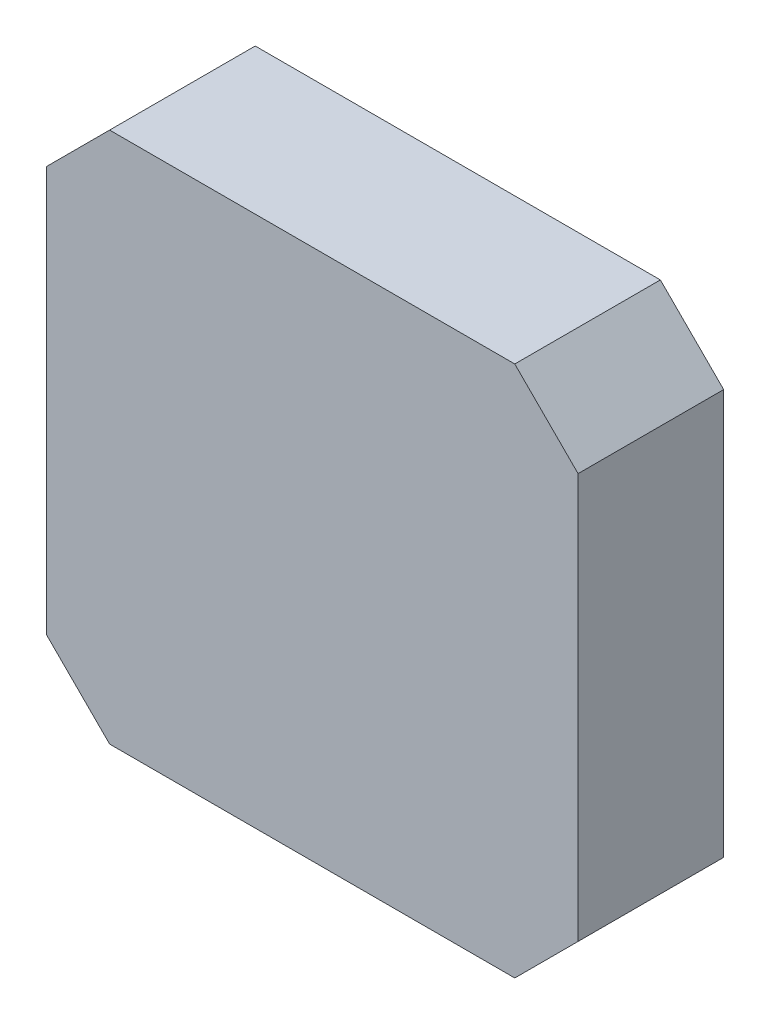
ISO-10303-21;
HEADER;
FILE_DESCRIPTION(('STEP AP214'),'2;1');
FILE_NAME('part.step','',(''),(''),'','','');
FILE_SCHEMA(('AUTOMOTIVE_DESIGN { 1 0 10303 214 1 1 1 1 }'));
ENDSEC;
DATA;
#1=APPLICATION_CONTEXT('core data for automotive mechanical design processes');
#2=APPLICATION_PROTOCOL_DEFINITION('international standard','automotive_design',2000,#1);
#3=PRODUCT_CONTEXT('',#1,'mechanical');
#4=PRODUCT('Part','Part','',(#3));
#5=PRODUCT_RELATED_PRODUCT_CATEGORY('part','',(#4));
#6=PRODUCT_DEFINITION_FORMATION('','',#4);
#7=PRODUCT_DEFINITION_CONTEXT('part definition',#1,'design');
#8=PRODUCT_DEFINITION('design','',#6,#7);
#9=PRODUCT_DEFINITION_SHAPE('','',#8);
#10=(LENGTH_UNIT() NAMED_UNIT(*) SI_UNIT(.MILLI.,.METRE.));
#11=(NAMED_UNIT(*) PLANE_ANGLE_UNIT() SI_UNIT($,.RADIAN.));
#12=(NAMED_UNIT(*) SI_UNIT($,.STERADIAN.) SOLID_ANGLE_UNIT());
#13=UNCERTAINTY_MEASURE_WITH_UNIT(LENGTH_MEASURE(1.E-05),#10,'distance_accuracy_value','');
#14=(GEOMETRIC_REPRESENTATION_CONTEXT(3) GLOBAL_UNCERTAINTY_ASSIGNED_CONTEXT((#13)) GLOBAL_UNIT_ASSIGNED_CONTEXT((#10,
#11,#12)) REPRESENTATION_CONTEXT('',''));
#15=CARTESIAN_POINT('',(0.,0.,0.));
#16=DIRECTION('',(0.,0.,1.));
#17=DIRECTION('',(1.,0.,0.));
#18=AXIS2_PLACEMENT_3D('',#15,#16,#17);
#19=CARTESIAN_POINT('',(21.,21.,11.5));
#20=DIRECTION('',(-1.,0.,0.));
#21=DIRECTION('',(0.,0.,1.));
#22=AXIS2_PLACEMENT_3D('',#19,#20,#21);
#23=PLANE('',#22);
#24=DIRECTION('',(0.,1.,0.));
#25=VECTOR('',#24,1.);
#26=CARTESIAN_POINT('',(21.,21.,0.));
#27=LINE('',#26,#25);
#28=CARTESIAN_POINT('',(21.,-16.,0.));
#29=VERTEX_POINT('',#28);
#30=CARTESIAN_POINT('',(21.,16.,0.));
#31=VERTEX_POINT('',#30);
#32=EDGE_CURVE('E132',#29,#31,#27,.T.);
#33=ORIENTED_EDGE('',*,*,#32,.T.);
#34=DIRECTION('',(0.,0.,1.));
#35=VECTOR('',#34,1.);
#36=CARTESIAN_POINT('',(21.,16.,11.5));
#37=LINE('',#36,#35);
#38=CARTESIAN_POINT('',(21.,16.,11.5));
#39=VERTEX_POINT('',#38);
#40=EDGE_CURVE('E155',#31,#39,#37,.T.);
#41=ORIENTED_EDGE('',*,*,#40,.T.);
#42=DIRECTION('',(0.,1.,0.));
#43=VECTOR('',#42,1.);
#44=CARTESIAN_POINT('',(21.,21.,11.5));
#45=LINE('',#44,#43);
#46=CARTESIAN_POINT('',(21.,-16.,11.5));
#47=VERTEX_POINT('',#46);
#48=EDGE_CURVE('E130',#47,#39,#45,.T.);
#49=ORIENTED_EDGE('',*,*,#48,.F.);
#50=DIRECTION('',(0.,0.,-1.));
#51=VECTOR('',#50,1.);
#52=CARTESIAN_POINT('',(21.,-16.,11.5));
#53=LINE('',#52,#51);
#54=EDGE_CURVE('E152',#47,#29,#53,.T.);
#55=ORIENTED_EDGE('',*,*,#54,.T.);
#56=EDGE_LOOP('',(#33,#41,#49,#55));
#57=FACE_BOUND('',#56,.T.);
#58=ADVANCED_FACE('F37',(#57),#23,.F.);
#59=CARTESIAN_POINT('',(-21.,21.,11.5));
#60=DIRECTION('',(0.,-1.,0.));
#61=DIRECTION('',(0.,0.,-1.));
#62=AXIS2_PLACEMENT_3D('',#59,#60,#61);
#63=PLANE('',#62);
#64=DIRECTION('',(-1.,0.,0.));
#65=VECTOR('',#64,1.);
#66=CARTESIAN_POINT('',(-21.,21.,0.));
#67=LINE('',#66,#65);
#68=CARTESIAN_POINT('',(16.,21.,0.));
#69=VERTEX_POINT('',#68);
#70=CARTESIAN_POINT('',(-16.,21.,0.));
#71=VERTEX_POINT('',#70);
#72=EDGE_CURVE('E128',#69,#71,#67,.T.);
#73=ORIENTED_EDGE('',*,*,#72,.T.);
#74=DIRECTION('',(0.,0.,1.));
#75=VECTOR('',#74,1.);
#76=CARTESIAN_POINT('',(-16.,21.,11.5));
#77=LINE('',#76,#75);
#78=CARTESIAN_POINT('',(-16.,21.,11.5));
#79=VERTEX_POINT('',#78);
#80=EDGE_CURVE('E107',#71,#79,#77,.T.);
#81=ORIENTED_EDGE('',*,*,#80,.T.);
#82=DIRECTION('',(-1.,0.,0.));
#83=VECTOR('',#82,1.);
#84=CARTESIAN_POINT('',(-21.,21.,11.5));
#85=LINE('',#84,#83);
#86=CARTESIAN_POINT('',(16.,21.,11.5));
#87=VERTEX_POINT('',#86);
#88=EDGE_CURVE('E171',#87,#79,#85,.T.);
#89=ORIENTED_EDGE('',*,*,#88,.F.);
#90=DIRECTION('',(0.,0.,-1.));
#91=VECTOR('',#90,1.);
#92=CARTESIAN_POINT('',(16.,21.,11.5));
#93=LINE('',#92,#91);
#94=EDGE_CURVE('E112',#87,#69,#93,.T.);
#95=ORIENTED_EDGE('',*,*,#94,.T.);
#96=EDGE_LOOP('',(#73,#81,#89,#95));
#97=FACE_BOUND('',#96,.T.);
#98=ADVANCED_FACE('F188',(#97),#63,.F.);
#99=CARTESIAN_POINT('',(-21.,21.,11.5));
#100=DIRECTION('',(1.,0.,0.));
#101=DIRECTION('',(0.,1.,0.));
#102=AXIS2_PLACEMENT_3D('',#99,#100,#101);
#103=PLANE('',#102);
#104=DIRECTION('',(0.,-1.,0.));
#105=VECTOR('',#104,1.);
#106=CARTESIAN_POINT('',(-21.,21.,11.5));
#107=LINE('',#106,#105);
#108=CARTESIAN_POINT('',(-21.,16.,11.5));
#109=VERTEX_POINT('',#108);
#110=CARTESIAN_POINT('',(-21.,-16.,11.5));
#111=VERTEX_POINT('',#110);
#112=EDGE_CURVE('E121',#109,#111,#107,.T.);
#113=ORIENTED_EDGE('',*,*,#112,.F.);
#114=DIRECTION('',(0.,0.,-1.));
#115=VECTOR('',#114,1.);
#116=CARTESIAN_POINT('',(-21.,16.,11.5));
#117=LINE('',#116,#115);
#118=CARTESIAN_POINT('',(-21.,16.,0.));
#119=VERTEX_POINT('',#118);
#120=EDGE_CURVE('E106',#109,#119,#117,.T.);
#121=ORIENTED_EDGE('',*,*,#120,.T.);
#122=DIRECTION('',(0.,-1.,0.));
#123=VECTOR('',#122,1.);
#124=CARTESIAN_POINT('',(-21.,21.,0.));
#125=LINE('',#124,#123);
#126=CARTESIAN_POINT('',(-21.,-16.,0.));
#127=VERTEX_POINT('',#126);
#128=EDGE_CURVE('E119',#119,#127,#125,.T.);
#129=ORIENTED_EDGE('',*,*,#128,.T.);
#130=DIRECTION('',(0.,0.,1.));
#131=VECTOR('',#130,1.);
#132=CARTESIAN_POINT('',(-21.,-16.,11.5));
#133=LINE('',#132,#131);
#134=EDGE_CURVE('E123',#127,#111,#133,.T.);
#135=ORIENTED_EDGE('',*,*,#134,.T.);
#136=EDGE_LOOP('',(#113,#121,#129,#135));
#137=FACE_BOUND('',#136,.T.);
#138=ADVANCED_FACE('F118',(#137),#103,.F.);
#139=CARTESIAN_POINT('',(-21.,-21.,11.5));
#140=DIRECTION('',(0.,1.,0.));
#141=DIRECTION('',(0.,0.,1.));
#142=AXIS2_PLACEMENT_3D('',#139,#140,#141);
#143=PLANE('',#142);
#144=DIRECTION('',(1.,0.,0.));
#145=VECTOR('',#144,1.);
#146=CARTESIAN_POINT('',(-21.,-21.,0.));
#147=LINE('',#146,#145);
#148=CARTESIAN_POINT('',(-16.,-21.,0.));
#149=VERTEX_POINT('',#148);
#150=CARTESIAN_POINT('',(16.,-21.,0.));
#151=VERTEX_POINT('',#150);
#152=EDGE_CURVE('E127',#149,#151,#147,.T.);
#153=ORIENTED_EDGE('',*,*,#152,.T.);
#154=DIRECTION('',(0.,0.,1.));
#155=VECTOR('',#154,1.);
#156=CARTESIAN_POINT('',(16.,-21.,11.5));
#157=LINE('',#156,#155);
#158=CARTESIAN_POINT('',(16.,-21.,11.5));
#159=VERTEX_POINT('',#158);
#160=EDGE_CURVE('E11',#151,#159,#157,.T.);
#161=ORIENTED_EDGE('',*,*,#160,.T.);
#162=DIRECTION('',(1.,0.,0.));
#163=VECTOR('',#162,1.);
#164=CARTESIAN_POINT('',(-21.,-21.,11.5));
#165=LINE('',#164,#163);
#166=CARTESIAN_POINT('',(-16.,-21.,11.5));
#167=VERTEX_POINT('',#166);
#168=EDGE_CURVE('E136',#167,#159,#165,.T.);
#169=ORIENTED_EDGE('',*,*,#168,.F.);
#170=DIRECTION('',(0.,0.,-1.));
#171=VECTOR('',#170,1.);
#172=CARTESIAN_POINT('',(-16.,-21.,11.5));
#173=LINE('',#172,#171);
#174=EDGE_CURVE('E45',#167,#149,#173,.T.);
#175=ORIENTED_EDGE('',*,*,#174,.T.);
#176=EDGE_LOOP('',(#153,#161,#169,#175));
#177=FACE_BOUND('',#176,.T.);
#178=ADVANCED_FACE('F158',(#177),#143,.F.);
#179=CARTESIAN_POINT('',(0.,0.,11.5));
#180=DIRECTION('',(0.,0.,1.));
#181=DIRECTION('',(1.,0.,0.));
#182=AXIS2_PLACEMENT_3D('',#179,#180,#181);
#183=PLANE('',#182);
#184=ORIENTED_EDGE('',*,*,#88,.T.);
#185=DIRECTION('',(0.707106781186549,0.707106781186547,0.));
#186=VECTOR('',#185,1.);
#187=CARTESIAN_POINT('',(-18.5,18.5,11.5));
#188=LINE('',#187,#186);
#189=EDGE_CURVE('E150',#79,#109,#188,.F.);
#190=ORIENTED_EDGE('',*,*,#189,.T.);
#191=ORIENTED_EDGE('',*,*,#112,.T.);
#192=DIRECTION('',(-0.707106781186547,0.707106781186549,0.));
#193=VECTOR('',#192,1.);
#194=CARTESIAN_POINT('',(-18.5,-18.5,11.5));
#195=LINE('',#194,#193);
#196=EDGE_CURVE('E57',#111,#167,#195,.F.);
#197=ORIENTED_EDGE('',*,*,#196,.T.);
#198=ORIENTED_EDGE('',*,*,#168,.T.);
#199=DIRECTION('',(-0.707106781186549,-0.707106781186546,0.));
#200=VECTOR('',#199,1.);
#201=CARTESIAN_POINT('',(18.5,-18.5,11.5));
#202=LINE('',#201,#200);
#203=EDGE_CURVE('E146',#159,#47,#202,.F.);
#204=ORIENTED_EDGE('',*,*,#203,.T.);
#205=ORIENTED_EDGE('',*,*,#48,.T.);
#206=DIRECTION('',(0.707106781186547,-0.707106781186549,0.));
#207=VECTOR('',#206,1.);
#208=CARTESIAN_POINT('',(18.5,18.5,11.5));
#209=LINE('',#208,#207);
#210=EDGE_CURVE('E148',#39,#87,#209,.F.);
#211=ORIENTED_EDGE('',*,*,#210,.T.);
#212=EDGE_LOOP('',(#184,#190,#191,#197,#198,#204,#205,#211));
#213=FACE_BOUND('',#212,.T.);
#214=ADVANCED_FACE('F177',(#213),#183,.T.);
#215=CARTESIAN_POINT('',(0.,0.,0.));
#216=DIRECTION('',(0.,0.,1.));
#217=DIRECTION('',(1.,0.,0.));
#218=AXIS2_PLACEMENT_3D('',#215,#216,#217);
#219=PLANE('',#218);
#220=ORIENTED_EDGE('',*,*,#128,.F.);
#221=DIRECTION('',(-0.707106781186549,-0.707106781186547,0.));
#222=VECTOR('',#221,1.);
#223=CARTESIAN_POINT('',(-21.,16.,0.));
#224=LINE('',#223,#222);
#225=EDGE_CURVE('E102',#119,#71,#224,.F.);
#226=ORIENTED_EDGE('',*,*,#225,.T.);
#227=ORIENTED_EDGE('',*,*,#72,.F.);
#228=DIRECTION('',(-0.707106781186547,0.707106781186549,0.));
#229=VECTOR('',#228,1.);
#230=CARTESIAN_POINT('',(16.,21.,0.));
#231=LINE('',#230,#229);
#232=EDGE_CURVE('E113',#69,#31,#231,.F.);
#233=ORIENTED_EDGE('',*,*,#232,.T.);
#234=ORIENTED_EDGE('',*,*,#32,.F.);
#235=DIRECTION('',(0.707106781186549,0.707106781186546,0.));
#236=VECTOR('',#235,1.);
#237=CARTESIAN_POINT('',(21.,-16.,0.));
#238=LINE('',#237,#236);
#239=EDGE_CURVE('E139',#29,#151,#238,.F.);
#240=ORIENTED_EDGE('',*,*,#239,.T.);
#241=ORIENTED_EDGE('',*,*,#152,.F.);
#242=DIRECTION('',(0.707106781186547,-0.707106781186549,0.));
#243=VECTOR('',#242,1.);
#244=CARTESIAN_POINT('',(-16.,-21.,0.));
#245=LINE('',#244,#243);
#246=EDGE_CURVE('E122',#149,#127,#245,.F.);
#247=ORIENTED_EDGE('',*,*,#246,.T.);
#248=EDGE_LOOP('',(#220,#226,#227,#233,#234,#240,#241,#247));
#249=FACE_BOUND('',#248,.T.);
#250=ADVANCED_FACE('F125',(#249),#219,.F.);
#251=CARTESIAN_POINT('',(-21.,16.,11.5));
#252=DIRECTION('',(0.707106781186546,-0.707106781186548,0.));
#253=DIRECTION('',(0.,0.,-1.));
#254=AXIS2_PLACEMENT_3D('',#251,#252,#253);
#255=PLANE('',#254);
#256=ORIENTED_EDGE('',*,*,#189,.F.);
#257=ORIENTED_EDGE('',*,*,#80,.F.);
#258=ORIENTED_EDGE('',*,*,#225,.F.);
#259=ORIENTED_EDGE('',*,*,#120,.F.);
#260=EDGE_LOOP('',(#256,#257,#258,#259));
#261=FACE_BOUND('',#260,.T.);
#262=ADVANCED_FACE('F105',(#261),#255,.F.);
#263=CARTESIAN_POINT('',(16.,21.,11.5));
#264=DIRECTION('',(-0.707106781186548,-0.707106781186546,0.));
#265=DIRECTION('',(0.,0.,-1.));
#266=AXIS2_PLACEMENT_3D('',#263,#264,#265);
#267=PLANE('',#266);
#268=ORIENTED_EDGE('',*,*,#210,.F.);
#269=ORIENTED_EDGE('',*,*,#40,.F.);
#270=ORIENTED_EDGE('',*,*,#232,.F.);
#271=ORIENTED_EDGE('',*,*,#94,.F.);
#272=EDGE_LOOP('',(#268,#269,#270,#271));
#273=FACE_BOUND('',#272,.T.);
#274=ADVANCED_FACE('F199',(#273),#267,.F.);
#275=CARTESIAN_POINT('',(21.,-16.,11.5));
#276=DIRECTION('',(-0.707106781186546,0.707106781186549,0.));
#277=DIRECTION('',(0.,0.,-1.));
#278=AXIS2_PLACEMENT_3D('',#275,#276,#277);
#279=PLANE('',#278);
#280=ORIENTED_EDGE('',*,*,#203,.F.);
#281=ORIENTED_EDGE('',*,*,#160,.F.);
#282=ORIENTED_EDGE('',*,*,#239,.F.);
#283=ORIENTED_EDGE('',*,*,#54,.F.);
#284=EDGE_LOOP('',(#280,#281,#282,#283));
#285=FACE_BOUND('',#284,.T.);
#286=ADVANCED_FACE('F165',(#285),#279,.F.);
#287=CARTESIAN_POINT('',(-16.,-21.,11.5));
#288=DIRECTION('',(0.707106781186548,0.707106781186546,0.));
#289=DIRECTION('',(0.,0.,-1.));
#290=AXIS2_PLACEMENT_3D('',#287,#288,#289);
#291=PLANE('',#290);
#292=ORIENTED_EDGE('',*,*,#196,.F.);
#293=ORIENTED_EDGE('',*,*,#134,.F.);
#294=ORIENTED_EDGE('',*,*,#246,.F.);
#295=ORIENTED_EDGE('',*,*,#174,.F.);
#296=EDGE_LOOP('',(#292,#293,#294,#295));
#297=FACE_BOUND('',#296,.T.);
#298=ADVANCED_FACE('F39',(#297),#291,.F.);
#299=CLOSED_SHELL('',(#58,#98,#138,#178,#214,#250,#262,#274,#286,#298));
#300=MANIFOLD_SOLID_BREP('B2',#299);
#301=ADVANCED_BREP_SHAPE_REPRESENTATION('',(#18,#300),#14);
#302=SHAPE_DEFINITION_REPRESENTATION(#9,#301);
ENDSEC;
END-ISO-10303-21;
